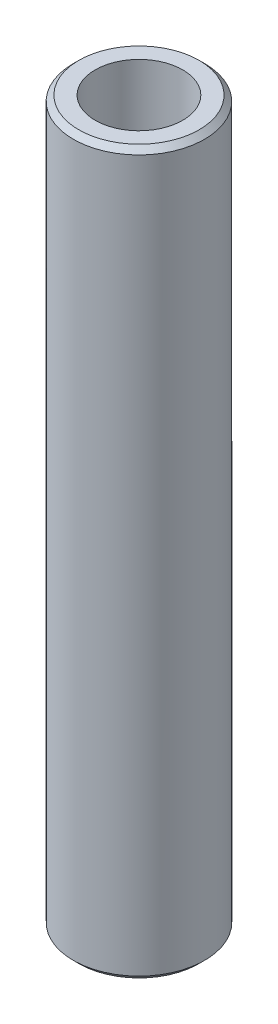
ISO-10303-21;
HEADER;
FILE_DESCRIPTION(('STEP AP214'),'2;1');
FILE_NAME('part.step','',(''),(''),'','','');
FILE_SCHEMA(('AUTOMOTIVE_DESIGN { 1 0 10303 214 1 1 1 1 }'));
ENDSEC;
DATA;
#1=APPLICATION_CONTEXT('core data for automotive mechanical design processes');
#2=APPLICATION_PROTOCOL_DEFINITION('international standard','automotive_design',2000,#1);
#3=PRODUCT_CONTEXT('',#1,'mechanical');
#4=PRODUCT('Part','Part','',(#3));
#5=PRODUCT_RELATED_PRODUCT_CATEGORY('part','',(#4));
#6=PRODUCT_DEFINITION_FORMATION('','',#4);
#7=PRODUCT_DEFINITION_CONTEXT('part definition',#1,'design');
#8=PRODUCT_DEFINITION('design','',#6,#7);
#9=PRODUCT_DEFINITION_SHAPE('','',#8);
#10=(LENGTH_UNIT() NAMED_UNIT(*) SI_UNIT(.MILLI.,.METRE.));
#11=(NAMED_UNIT(*) PLANE_ANGLE_UNIT() SI_UNIT($,.RADIAN.));
#12=(NAMED_UNIT(*) SI_UNIT($,.STERADIAN.) SOLID_ANGLE_UNIT());
#13=UNCERTAINTY_MEASURE_WITH_UNIT(LENGTH_MEASURE(1.E-05),#10,'distance_accuracy_value','');
#14=(GEOMETRIC_REPRESENTATION_CONTEXT(3) GLOBAL_UNCERTAINTY_ASSIGNED_CONTEXT((#13)) GLOBAL_UNIT_ASSIGNED_CONTEXT((#10,
#11,#12)) REPRESENTATION_CONTEXT('',''));
#15=CARTESIAN_POINT('',(0.,0.,0.));
#16=DIRECTION('',(0.,0.,1.));
#17=DIRECTION('',(1.,0.,0.));
#18=AXIS2_PLACEMENT_3D('',#15,#16,#17);
#19=CARTESIAN_POINT('',(0.,2.25,0.));
#20=DIRECTION('',(0.,1.,0.));
#21=DIRECTION('',(0.,0.,1.));
#22=AXIS2_PLACEMENT_3D('',#19,#20,#21);
#23=TOROIDAL_SURFACE('',#22,3.75,0.25);
#24=CARTESIAN_POINT('',(0.,2.25,0.));
#25=DIRECTION('',(0.,1.,0.));
#26=DIRECTION('',(-1.,0.,0.));
#27=AXIS2_PLACEMENT_3D('',#24,#25,#26);
#28=CIRCLE('',#27,4.);
#29=CARTESIAN_POINT('',(-4.,2.25,0.));
#30=VERTEX_POINT('',#29);
#31=EDGE_CURVE('E36',#30,#30,#28,.T.);
#32=ORIENTED_EDGE('',*,*,#31,.T.);
#33=EDGE_LOOP('',(#32));
#34=FACE_BOUND('',#33,.T.);
#35=CARTESIAN_POINT('',(0.,2.,0.));
#36=DIRECTION('',(0.,-1.,0.));
#37=DIRECTION('',(-1.,0.,0.));
#38=AXIS2_PLACEMENT_3D('',#35,#36,#37);
#39=CIRCLE('',#38,3.75);
#40=CARTESIAN_POINT('',(-3.75,2.,0.));
#41=VERTEX_POINT('',#40);
#42=EDGE_CURVE('E39',#41,#41,#39,.F.);
#43=ORIENTED_EDGE('',*,*,#42,.F.);
#44=EDGE_LOOP('',(#43));
#45=FACE_BOUND('',#44,.T.);
#46=ADVANCED_FACE('F15',(#34,#45),#23,.F.);
#47=CARTESIAN_POINT('',(-3.375,2.,0.));
#48=DIRECTION('',(0.,1.,0.));
#49=DIRECTION('',(0.,0.,1.));
#50=AXIS2_PLACEMENT_3D('',#47,#48,#49);
#51=PLANE('',#50);
#52=CARTESIAN_POINT('',(0.,2.,0.));
#53=DIRECTION('',(0.,1.,0.));
#54=DIRECTION('',(-1.,0.,0.));
#55=AXIS2_PLACEMENT_3D('',#52,#53,#54);
#56=CIRCLE('',#55,3.);
#57=CARTESIAN_POINT('',(-3.,2.,0.));
#58=VERTEX_POINT('',#57);
#59=EDGE_CURVE('E20',#58,#58,#56,.F.);
#60=ORIENTED_EDGE('',*,*,#59,.T.);
#61=EDGE_LOOP('',(#60));
#62=FACE_BOUND('',#61,.T.);
#63=ORIENTED_EDGE('',*,*,#42,.T.);
#64=EDGE_LOOP('',(#63));
#65=FACE_BOUND('',#64,.T.);
#66=ADVANCED_FACE('F50',(#62,#65),#51,.T.);
#67=CARTESIAN_POINT('',(0.,34.125,0.));
#68=DIRECTION('',(0.,1.,0.));
#69=DIRECTION('',(-1.,0.,0.));
#70=AXIS2_PLACEMENT_3D('',#67,#68,#69);
#71=CYLINDRICAL_SURFACE('',#70,4.);
#72=CARTESIAN_POINT('',(0.,66.,0.));
#73=DIRECTION('',(0.,1.,0.));
#74=DIRECTION('',(-1.,0.,0.));
#75=AXIS2_PLACEMENT_3D('',#72,#73,#74);
#76=CIRCLE('',#75,4.);
#77=CARTESIAN_POINT('',(-4.00000000000001,66.,0.));
#78=VERTEX_POINT('',#77);
#79=EDGE_CURVE('E171',#78,#78,#76,.F.);
#80=ORIENTED_EDGE('',*,*,#79,.F.);
#81=EDGE_LOOP('',(#80));
#82=FACE_BOUND('',#81,.T.);
#83=ORIENTED_EDGE('',*,*,#31,.F.);
#84=EDGE_LOOP('',(#83));
#85=FACE_BOUND('',#84,.T.);
#86=ADVANCED_FACE('F59',(#82,#85),#71,.F.);
#87=CARTESIAN_POINT('',(0.,0.999999999999992,0.));
#88=DIRECTION('',(0.,1.,0.));
#89=DIRECTION('',(-1.,0.,0.));
#90=AXIS2_PLACEMENT_3D('',#87,#88,#89);
#91=CYLINDRICAL_SURFACE('',#90,3.);
#92=ORIENTED_EDGE('',*,*,#59,.F.);
#93=EDGE_LOOP('',(#92));
#94=FACE_BOUND('',#93,.T.);
#95=CARTESIAN_POINT('',(0.,0.,0.));
#96=DIRECTION('',(0.,1.,0.));
#97=DIRECTION('',(-1.,0.,0.));
#98=AXIS2_PLACEMENT_3D('',#95,#96,#97);
#99=CIRCLE('',#98,3.);
#100=CARTESIAN_POINT('',(-3.,0.,0.));
#101=VERTEX_POINT('',#100);
#102=EDGE_CURVE('E169',#101,#101,#99,.T.);
#103=ORIENTED_EDGE('',*,*,#102,.F.);
#104=EDGE_LOOP('',(#103));
#105=FACE_BOUND('',#104,.T.);
#106=ADVANCED_FACE('F63',(#94,#105),#91,.F.);
#107=CARTESIAN_POINT('',(-5.00000000000001,66.,0.));
#108=DIRECTION('',(0.,1.,0.));
#109=DIRECTION('',(0.,0.,1.));
#110=AXIS2_PLACEMENT_3D('',#107,#108,#109);
#111=PLANE('',#110);
#112=ORIENTED_EDGE('',*,*,#79,.T.);
#113=EDGE_LOOP('',(#112));
#114=FACE_BOUND('',#113,.T.);
#115=CARTESIAN_POINT('',(0.,66.0000000002583,0.));
#116=DIRECTION('',(0.,-1.,0.));
#117=DIRECTION('',(0.,0.,-1.));
#118=AXIS2_PLACEMENT_3D('',#115,#116,#117);
#119=CIRCLE('',#118,5.50000000026786);
#120=CARTESIAN_POINT('',(0.,66.0000000002583,-5.50000000026786));
#121=VERTEX_POINT('',#120);
#122=EDGE_CURVE('E166',#121,#121,#119,.T.);
#123=ORIENTED_EDGE('',*,*,#122,.F.);
#124=EDGE_LOOP('',(#123));
#125=FACE_BOUND('',#124,.T.);
#126=ADVANCED_FACE('F67',(#114,#125),#111,.T.);
#127=CARTESIAN_POINT('',(-4.5,0.,0.));
#128=DIRECTION('',(0.,-1.,0.));
#129=DIRECTION('',(0.,0.,-1.));
#130=AXIS2_PLACEMENT_3D('',#127,#128,#129);
#131=PLANE('',#130);
#132=ORIENTED_EDGE('',*,*,#102,.T.);
#133=EDGE_LOOP('',(#132));
#134=FACE_BOUND('',#133,.T.);
#135=CARTESIAN_POINT('',(0.,-1.70530907103728E-10,0.));
#136=DIRECTION('',(0.,1.,0.));
#137=DIRECTION('',(-1.,0.,0.));
#138=AXIS2_PLACEMENT_3D('',#135,#136,#137);
#139=CIRCLE('',#138,5.500000000211);
#140=CARTESIAN_POINT('',(-5.500000000211,-1.70531602800122E-10,0.));
#141=VERTEX_POINT('',#140);
#142=EDGE_CURVE('E29',#141,#141,#139,.T.);
#143=ORIENTED_EDGE('',*,*,#142,.F.);
#144=EDGE_LOOP('',(#143));
#145=FACE_BOUND('',#144,.T.);
#146=ADVANCED_FACE('F71',(#134,#145),#131,.T.);
#147=CARTESIAN_POINT('',(0.,65.4999999998722,0.));
#148=DIRECTION('',(0.,-1.,0.));
#149=DIRECTION('',(0.,0.,-1.));
#150=AXIS2_PLACEMENT_3D('',#147,#148,#149);
#151=CONICAL_SURFACE('',#150,5.9999999996876,0.78539816243111);
#152=ORIENTED_EDGE('',*,*,#122,.T.);
#153=EDGE_LOOP('',(#152));
#154=FACE_BOUND('',#153,.T.);
#155=CARTESIAN_POINT('',(0.,65.5,0.));
#156=DIRECTION('',(0.,1.,0.));
#157=DIRECTION('',(-1.,0.,0.));
#158=AXIS2_PLACEMENT_3D('',#155,#156,#157);
#159=CIRCLE('',#158,6.);
#160=CARTESIAN_POINT('',(-6.00000000000001,65.5,0.));
#161=VERTEX_POINT('',#160);
#162=EDGE_CURVE('E24',#161,#161,#159,.F.);
#163=ORIENTED_EDGE('',*,*,#162,.F.);
#164=EDGE_LOOP('',(#163));
#165=FACE_BOUND('',#164,.T.);
#166=ADVANCED_FACE('F75',(#154,#165),#151,.T.);
#167=CARTESIAN_POINT('',(0.,0.500000000272393,0.));
#168=DIRECTION('',(0.,1.,0.));
#169=DIRECTION('',(-1.,0.,0.));
#170=AXIS2_PLACEMENT_3D('',#167,#168,#169);
#171=CONICAL_SURFACE('',#170,5.99999999974443,0.785398162487954);
#172=CARTESIAN_POINT('',(0.,0.5,0.));
#173=DIRECTION('',(0.,1.,0.));
#174=DIRECTION('',(-1.,0.,0.));
#175=AXIS2_PLACEMENT_3D('',#172,#173,#174);
#176=CIRCLE('',#175,6.);
#177=CARTESIAN_POINT('',(-6.,0.5,0.));
#178=VERTEX_POINT('',#177);
#179=EDGE_CURVE('E10',#178,#178,#176,.T.);
#180=ORIENTED_EDGE('',*,*,#179,.F.);
#181=EDGE_LOOP('',(#180));
#182=FACE_BOUND('',#181,.T.);
#183=ORIENTED_EDGE('',*,*,#142,.T.);
#184=EDGE_LOOP('',(#183));
#185=FACE_BOUND('',#184,.T.);
#186=ADVANCED_FACE('F79',(#182,#185),#171,.T.);
#187=CARTESIAN_POINT('',(0.,33.,0.));
#188=DIRECTION('',(0.,1.,0.));
#189=DIRECTION('',(-1.,0.,0.));
#190=AXIS2_PLACEMENT_3D('',#187,#188,#189);
#191=CYLINDRICAL_SURFACE('',#190,6.);
#192=ORIENTED_EDGE('',*,*,#179,.T.);
#193=EDGE_LOOP('',(#192));
#194=FACE_BOUND('',#193,.T.);
#195=ORIENTED_EDGE('',*,*,#162,.T.);
#196=EDGE_LOOP('',(#195));
#197=FACE_BOUND('',#196,.T.);
#198=ADVANCED_FACE('F83',(#194,#197),#191,.T.);
#199=CLOSED_SHELL('',(#46,#66,#86,#106,#126,#146,#166,#186,#198));
#200=MANIFOLD_SOLID_BREP('B1',#199);
#201=ADVANCED_BREP_SHAPE_REPRESENTATION('',(#18,#200),#14);
#202=SHAPE_DEFINITION_REPRESENTATION(#9,#201);
ENDSEC;
END-ISO-10303-21;
